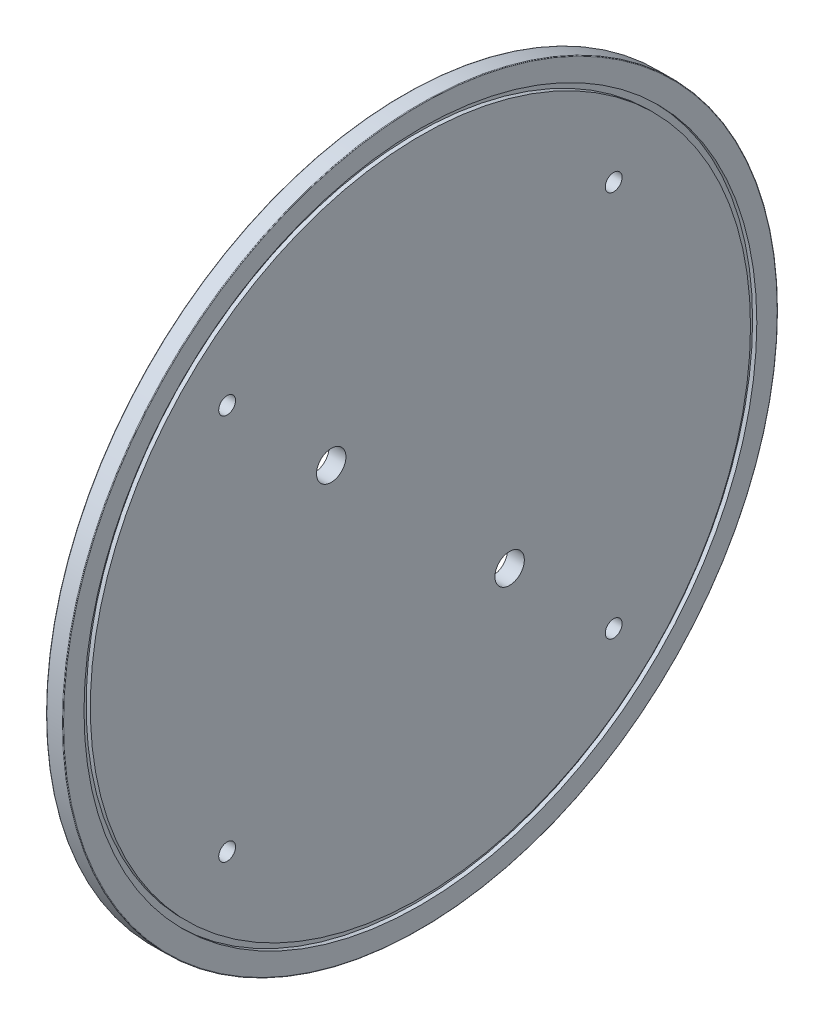
ISO-10303-21;
HEADER;
FILE_DESCRIPTION(('STEP AP214'),'2;1');
FILE_NAME('part.step','',(''),(''),'','','');
FILE_SCHEMA(('AUTOMOTIVE_DESIGN { 1 0 10303 214 1 1 1 1 }'));
ENDSEC;
DATA;
#1=APPLICATION_CONTEXT('core data for automotive mechanical design processes');
#2=APPLICATION_PROTOCOL_DEFINITION('international standard','automotive_design',2000,#1);
#3=PRODUCT_CONTEXT('',#1,'mechanical');
#4=PRODUCT('Part','Part','',(#3));
#5=PRODUCT_RELATED_PRODUCT_CATEGORY('part','',(#4));
#6=PRODUCT_DEFINITION_FORMATION('','',#4);
#7=PRODUCT_DEFINITION_CONTEXT('part definition',#1,'design');
#8=PRODUCT_DEFINITION('design','',#6,#7);
#9=PRODUCT_DEFINITION_SHAPE('','',#8);
#10=(LENGTH_UNIT() NAMED_UNIT(*) SI_UNIT(.MILLI.,.METRE.));
#11=(NAMED_UNIT(*) PLANE_ANGLE_UNIT() SI_UNIT($,.RADIAN.));
#12=(NAMED_UNIT(*) SI_UNIT($,.STERADIAN.) SOLID_ANGLE_UNIT());
#13=UNCERTAINTY_MEASURE_WITH_UNIT(LENGTH_MEASURE(1.E-05),#10,'distance_accuracy_value','');
#14=(GEOMETRIC_REPRESENTATION_CONTEXT(3) GLOBAL_UNCERTAINTY_ASSIGNED_CONTEXT((#13)) GLOBAL_UNIT_ASSIGNED_CONTEXT((#10,
#11,#12)) REPRESENTATION_CONTEXT('',''));
#15=CARTESIAN_POINT('',(0.,0.,0.));
#16=DIRECTION('',(0.,0.,1.));
#17=DIRECTION('',(1.,0.,0.));
#18=AXIS2_PLACEMENT_3D('',#15,#16,#17);
#19=CARTESIAN_POINT('',(8.,0.,0.));
#20=DIRECTION('',(1.,0.,0.));
#21=DIRECTION('',(0.,0.,-1.));
#22=AXIS2_PLACEMENT_3D('',#19,#20,#21);
#23=PLANE('',#22);
#24=CARTESIAN_POINT('',(8.,42.4264068711929,42.4264068711929));
#25=DIRECTION('',(1.,0.,0.));
#26=DIRECTION('',(0.,0.,1.));
#27=AXIS2_PLACEMENT_3D('',#24,#25,#26);
#28=CIRCLE('',#27,7.);
#29=CARTESIAN_POINT('',(8.,42.4264068711929,49.4264068711929));
#30=VERTEX_POINT('',#29);
#31=EDGE_CURVE('E117',#30,#30,#28,.T.);
#32=ORIENTED_EDGE('',*,*,#31,.F.);
#33=EDGE_LOOP('',(#32));
#34=FACE_BOUND('',#33,.T.);
#35=CARTESIAN_POINT('',(8.,-42.4264068711929,-42.4264068711929));
#36=DIRECTION('',(1.,0.,0.));
#37=DIRECTION('',(0.,0.,-1.));
#38=AXIS2_PLACEMENT_3D('',#35,#36,#37);
#39=CIRCLE('',#38,7.);
#40=CARTESIAN_POINT('',(8.,-42.4264068711929,-49.4264068711929));
#41=VERTEX_POINT('',#40);
#42=EDGE_CURVE('E109',#41,#41,#39,.T.);
#43=ORIENTED_EDGE('',*,*,#42,.F.);
#44=EDGE_LOOP('',(#43));
#45=FACE_BOUND('',#44,.T.);
#46=CARTESIAN_POINT('',(8.,91.9238815542512,91.9238815542512));
#47=DIRECTION('',(1.,0.,0.));
#48=DIRECTION('',(0.,0.,-1.));
#49=AXIS2_PLACEMENT_3D('',#46,#47,#48);
#50=CIRCLE('',#49,4.00000000000001);
#51=CARTESIAN_POINT('',(8.,91.9238815542512,87.9238815542512));
#52=VERTEX_POINT('',#51);
#53=EDGE_CURVE('E66',#52,#52,#50,.T.);
#54=ORIENTED_EDGE('',*,*,#53,.F.);
#55=EDGE_LOOP('',(#54));
#56=FACE_BOUND('',#55,.T.);
#57=CARTESIAN_POINT('',(8.,91.9238815542521,-91.9238815542502));
#58=DIRECTION('',(1.,0.,0.));
#59=DIRECTION('',(0.,-1.,0.));
#60=AXIS2_PLACEMENT_3D('',#57,#58,#59);
#61=CIRCLE('',#60,4.00000000000001);
#62=CARTESIAN_POINT('',(8.,87.9238815542521,-91.9238815542502));
#63=VERTEX_POINT('',#62);
#64=EDGE_CURVE('E82',#63,#63,#61,.T.);
#65=ORIENTED_EDGE('',*,*,#64,.F.);
#66=EDGE_LOOP('',(#65));
#67=FACE_BOUND('',#66,.T.);
#68=CARTESIAN_POINT('',(8.,-91.9238815542512,-91.9238815542512));
#69=DIRECTION('',(1.,0.,0.));
#70=DIRECTION('',(0.,0.,1.));
#71=AXIS2_PLACEMENT_3D('',#68,#69,#70);
#72=CIRCLE('',#71,4.00000000000001);
#73=CARTESIAN_POINT('',(8.,-91.9238815542512,-87.9238815542512));
#74=VERTEX_POINT('',#73);
#75=EDGE_CURVE('E86',#74,#74,#72,.T.);
#76=ORIENTED_EDGE('',*,*,#75,.F.);
#77=EDGE_LOOP('',(#76));
#78=FACE_BOUND('',#77,.T.);
#79=CARTESIAN_POINT('',(8.,-91.9238815542515,91.9238815542508));
#80=DIRECTION('',(1.,0.,0.));
#81=DIRECTION('',(0.,1.,0.));
#82=AXIS2_PLACEMENT_3D('',#79,#80,#81);
#83=CIRCLE('',#82,4.00000000000001);
#84=CARTESIAN_POINT('',(8.,-87.9238815542515,91.9238815542509));
#85=VERTEX_POINT('',#84);
#86=EDGE_CURVE('E75',#85,#85,#83,.T.);
#87=ORIENTED_EDGE('',*,*,#86,.F.);
#88=EDGE_LOOP('',(#87));
#89=FACE_BOUND('',#88,.T.);
#90=CARTESIAN_POINT('',(8.,0.,0.));
#91=DIRECTION('',(1.,0.,0.));
#92=DIRECTION('',(0.,0.,-1.));
#93=AXIS2_PLACEMENT_3D('',#90,#91,#92);
#94=CIRCLE('',#93,157.);
#95=CARTESIAN_POINT('',(8.,0.,-157.));
#96=VERTEX_POINT('',#95);
#97=EDGE_CURVE('E102',#96,#96,#94,.T.);
#98=ORIENTED_EDGE('',*,*,#97,.T.);
#99=EDGE_LOOP('',(#98));
#100=FACE_BOUND('',#99,.T.);
#101=ADVANCED_FACE('F37',(#34,#45,#56,#67,#78,#89,#100),#23,.T.);
#102=CARTESIAN_POINT('',(8.,0.,0.));
#103=DIRECTION('',(-1.,0.,0.));
#104=DIRECTION('',(0.,0.,1.));
#105=AXIS2_PLACEMENT_3D('',#102,#103,#104);
#106=CYLINDRICAL_SURFACE('',#105,170.);
#107=CARTESIAN_POINT('',(0.3,0.,0.));
#108=DIRECTION('',(1.,0.,0.));
#109=DIRECTION('',(0.,0.,-1.));
#110=AXIS2_PLACEMENT_3D('',#107,#108,#109);
#111=CIRCLE('',#110,170.);
#112=CARTESIAN_POINT('',(0.3,0.,-170.));
#113=VERTEX_POINT('',#112);
#114=EDGE_CURVE('E51',#113,#113,#111,.T.);
#115=ORIENTED_EDGE('',*,*,#114,.T.);
#116=EDGE_LOOP('',(#115));
#117=FACE_BOUND('',#116,.T.);
#118=CARTESIAN_POINT('',(7.7,0.,0.));
#119=DIRECTION('',(1.,0.,0.));
#120=DIRECTION('',(0.,0.,-1.));
#121=AXIS2_PLACEMENT_3D('',#118,#119,#120);
#122=CIRCLE('',#121,170.);
#123=CARTESIAN_POINT('',(7.7,0.,-170.));
#124=VERTEX_POINT('',#123);
#125=EDGE_CURVE('E57',#124,#124,#122,.F.);
#126=ORIENTED_EDGE('',*,*,#125,.T.);
#127=EDGE_LOOP('',(#126));
#128=FACE_BOUND('',#127,.T.);
#129=ADVANCED_FACE('F127',(#117,#128),#106,.T.);
#130=CARTESIAN_POINT('',(8.,0.,0.));
#131=DIRECTION('',(1.,0.,0.));
#132=DIRECTION('',(0.,0.,-1.));
#133=AXIS2_PLACEMENT_3D('',#130,#131,#132);
#134=CIRCLE('',#133,169.7);
#135=CARTESIAN_POINT('',(8.,0.,-169.7));
#136=VERTEX_POINT('',#135);
#137=EDGE_CURVE('E10',#136,#136,#134,.T.);
#138=ORIENTED_EDGE('',*,*,#137,.T.);
#139=EDGE_LOOP('',(#138));
#140=FACE_BOUND('',#139,.T.);
#141=CARTESIAN_POINT('',(8.,0.,0.));
#142=DIRECTION('',(1.,0.,0.));
#143=DIRECTION('',(0.,0.,-1.));
#144=AXIS2_PLACEMENT_3D('',#141,#142,#143);
#145=CIRCLE('',#144,160.);
#146=CARTESIAN_POINT('',(8.,0.,-160.));
#147=VERTEX_POINT('',#146);
#148=EDGE_CURVE('E94',#147,#147,#145,.T.);
#149=ORIENTED_EDGE('',*,*,#148,.F.);
#150=EDGE_LOOP('',(#149));
#151=FACE_BOUND('',#150,.T.);
#152=ADVANCED_FACE('F129',(#140,#151),#23,.T.);
#153=CARTESIAN_POINT('',(0.,0.,0.));
#154=DIRECTION('',(1.,0.,0.));
#155=DIRECTION('',(0.,0.,-1.));
#156=AXIS2_PLACEMENT_3D('',#153,#154,#155);
#157=PLANE('',#156);
#158=CARTESIAN_POINT('',(0.,42.4264068711929,42.4264068711929));
#159=DIRECTION('',(1.,0.,0.));
#160=DIRECTION('',(0.,0.,1.));
#161=AXIS2_PLACEMENT_3D('',#158,#159,#160);
#162=CIRCLE('',#161,7.);
#163=CARTESIAN_POINT('',(0.,42.4264068711929,49.4264068711929));
#164=VERTEX_POINT('',#163);
#165=EDGE_CURVE('E113',#164,#164,#162,.T.);
#166=ORIENTED_EDGE('',*,*,#165,.T.);
#167=EDGE_LOOP('',(#166));
#168=FACE_BOUND('',#167,.T.);
#169=CARTESIAN_POINT('',(0.,-42.4264068711929,-42.4264068711929));
#170=DIRECTION('',(1.,0.,0.));
#171=DIRECTION('',(0.,0.,-1.));
#172=AXIS2_PLACEMENT_3D('',#169,#170,#171);
#173=CIRCLE('',#172,7.);
#174=CARTESIAN_POINT('',(0.,-42.4264068711929,-49.4264068711929));
#175=VERTEX_POINT('',#174);
#176=EDGE_CURVE('E41',#175,#175,#173,.T.);
#177=ORIENTED_EDGE('',*,*,#176,.T.);
#178=EDGE_LOOP('',(#177));
#179=FACE_BOUND('',#178,.T.);
#180=CARTESIAN_POINT('',(0.,0.,0.));
#181=DIRECTION('',(1.,0.,0.));
#182=DIRECTION('',(0.,0.,-1.));
#183=AXIS2_PLACEMENT_3D('',#180,#181,#182);
#184=CIRCLE('',#183,169.7);
#185=CARTESIAN_POINT('',(0.,0.,-169.7));
#186=VERTEX_POINT('',#185);
#187=EDGE_CURVE('E46',#186,#186,#184,.F.);
#188=ORIENTED_EDGE('',*,*,#187,.T.);
#189=EDGE_LOOP('',(#188));
#190=FACE_BOUND('',#189,.T.);
#191=CARTESIAN_POINT('',(0.,-91.9238815542515,91.9238815542508));
#192=DIRECTION('',(1.,0.,0.));
#193=DIRECTION('',(0.,0.,-1.));
#194=AXIS2_PLACEMENT_3D('',#191,#192,#193);
#195=CIRCLE('',#194,4.00000000000001);
#196=CARTESIAN_POINT('',(0.,-91.9238815542515,87.9238815542508));
#197=VERTEX_POINT('',#196);
#198=EDGE_CURVE('E62',#197,#197,#195,.T.);
#199=ORIENTED_EDGE('',*,*,#198,.T.);
#200=EDGE_LOOP('',(#199));
#201=FACE_BOUND('',#200,.T.);
#202=CARTESIAN_POINT('',(0.,-91.9238815542512,-91.9238815542512));
#203=DIRECTION('',(1.,0.,0.));
#204=DIRECTION('',(0.,0.,-1.));
#205=AXIS2_PLACEMENT_3D('',#202,#203,#204);
#206=CIRCLE('',#205,4.00000000000001);
#207=CARTESIAN_POINT('',(0.,-91.9238815542512,-95.9238815542512));
#208=VERTEX_POINT('',#207);
#209=EDGE_CURVE('E67',#208,#208,#206,.T.);
#210=ORIENTED_EDGE('',*,*,#209,.T.);
#211=EDGE_LOOP('',(#210));
#212=FACE_BOUND('',#211,.T.);
#213=CARTESIAN_POINT('',(0.,91.9238815542521,-91.9238815542502));
#214=DIRECTION('',(1.,0.,0.));
#215=DIRECTION('',(0.,0.,-1.));
#216=AXIS2_PLACEMENT_3D('',#213,#214,#215);
#217=CIRCLE('',#216,4.00000000000001);
#218=CARTESIAN_POINT('',(0.,91.9238815542521,-95.9238815542502));
#219=VERTEX_POINT('',#218);
#220=EDGE_CURVE('E71',#219,#219,#217,.T.);
#221=ORIENTED_EDGE('',*,*,#220,.T.);
#222=EDGE_LOOP('',(#221));
#223=FACE_BOUND('',#222,.T.);
#224=CARTESIAN_POINT('',(0.,91.9238815542512,91.9238815542512));
#225=DIRECTION('',(1.,0.,0.));
#226=DIRECTION('',(0.,0.,-1.));
#227=AXIS2_PLACEMENT_3D('',#224,#225,#226);
#228=CIRCLE('',#227,4.00000000000001);
#229=CARTESIAN_POINT('',(0.,91.9238815542512,87.9238815542512));
#230=VERTEX_POINT('',#229);
#231=EDGE_CURVE('E61',#230,#230,#228,.T.);
#232=ORIENTED_EDGE('',*,*,#231,.T.);
#233=EDGE_LOOP('',(#232));
#234=FACE_BOUND('',#233,.T.);
#235=ADVANCED_FACE('F177',(#168,#179,#190,#201,#212,#223,#234),#157,.F.);
#236=CARTESIAN_POINT('',(-2.,91.9238815542512,91.9238815542512));
#237=DIRECTION('',(1.,0.,0.));
#238=DIRECTION('',(0.,0.,-1.));
#239=AXIS2_PLACEMENT_3D('',#236,#237,#238);
#240=CYLINDRICAL_SURFACE('',#239,4.00000000000001);
#241=ORIENTED_EDGE('',*,*,#53,.T.);
#242=EDGE_LOOP('',(#241));
#243=FACE_BOUND('',#242,.T.);
#244=ORIENTED_EDGE('',*,*,#231,.F.);
#245=EDGE_LOOP('',(#244));
#246=FACE_BOUND('',#245,.T.);
#247=ADVANCED_FACE('F174',(#243,#246),#240,.F.);
#248=CARTESIAN_POINT('',(-2.,91.9238815542521,-91.9238815542502));
#249=DIRECTION('',(1.,0.,0.));
#250=DIRECTION('',(0.,0.,-1.));
#251=AXIS2_PLACEMENT_3D('',#248,#249,#250);
#252=CYLINDRICAL_SURFACE('',#251,4.00000000000001);
#253=ORIENTED_EDGE('',*,*,#64,.T.);
#254=EDGE_LOOP('',(#253));
#255=FACE_BOUND('',#254,.T.);
#256=ORIENTED_EDGE('',*,*,#220,.F.);
#257=EDGE_LOOP('',(#256));
#258=FACE_BOUND('',#257,.T.);
#259=ADVANCED_FACE('F170',(#255,#258),#252,.F.);
#260=CARTESIAN_POINT('',(-2.,-91.9238815542512,-91.9238815542512));
#261=DIRECTION('',(1.,0.,0.));
#262=DIRECTION('',(0.,0.,-1.));
#263=AXIS2_PLACEMENT_3D('',#260,#261,#262);
#264=CYLINDRICAL_SURFACE('',#263,4.00000000000001);
#265=ORIENTED_EDGE('',*,*,#75,.T.);
#266=EDGE_LOOP('',(#265));
#267=FACE_BOUND('',#266,.T.);
#268=ORIENTED_EDGE('',*,*,#209,.F.);
#269=EDGE_LOOP('',(#268));
#270=FACE_BOUND('',#269,.T.);
#271=ADVANCED_FACE('F166',(#267,#270),#264,.F.);
#272=CARTESIAN_POINT('',(-2.,-91.9238815542515,91.9238815542508));
#273=DIRECTION('',(1.,0.,0.));
#274=DIRECTION('',(0.,0.,-1.));
#275=AXIS2_PLACEMENT_3D('',#272,#273,#274);
#276=CYLINDRICAL_SURFACE('',#275,4.00000000000001);
#277=ORIENTED_EDGE('',*,*,#86,.T.);
#278=EDGE_LOOP('',(#277));
#279=FACE_BOUND('',#278,.T.);
#280=ORIENTED_EDGE('',*,*,#198,.F.);
#281=EDGE_LOOP('',(#280));
#282=FACE_BOUND('',#281,.T.);
#283=ADVANCED_FACE('F162',(#279,#282),#276,.F.);
#284=CARTESIAN_POINT('',(6.,0.,0.));
#285=DIRECTION('',(1.,0.,0.));
#286=DIRECTION('',(0.,0.,-1.));
#287=AXIS2_PLACEMENT_3D('',#284,#285,#286);
#288=CYLINDRICAL_SURFACE('',#287,160.);
#289=CARTESIAN_POINT('',(6.,0.,0.));
#290=DIRECTION('',(1.,0.,0.));
#291=DIRECTION('',(0.,0.,-1.));
#292=AXIS2_PLACEMENT_3D('',#289,#290,#291);
#293=CIRCLE('',#292,160.);
#294=CARTESIAN_POINT('',(6.,0.,-160.));
#295=VERTEX_POINT('',#294);
#296=EDGE_CURVE('E87',#295,#295,#293,.T.);
#297=ORIENTED_EDGE('',*,*,#296,.F.);
#298=EDGE_LOOP('',(#297));
#299=FACE_BOUND('',#298,.T.);
#300=ORIENTED_EDGE('',*,*,#148,.T.);
#301=EDGE_LOOP('',(#300));
#302=FACE_BOUND('',#301,.T.);
#303=ADVANCED_FACE('F153',(#299,#302),#288,.F.);
#304=CARTESIAN_POINT('',(6.,0.,0.));
#305=DIRECTION('',(1.,0.,0.));
#306=DIRECTION('',(0.,0.,-1.));
#307=AXIS2_PLACEMENT_3D('',#304,#305,#306);
#308=PLANE('',#307);
#309=CARTESIAN_POINT('',(6.,0.,0.));
#310=DIRECTION('',(1.,0.,0.));
#311=DIRECTION('',(0.,0.,-1.));
#312=AXIS2_PLACEMENT_3D('',#309,#310,#311);
#313=CIRCLE('',#312,157.);
#314=CARTESIAN_POINT('',(6.,0.,-157.));
#315=VERTEX_POINT('',#314);
#316=EDGE_CURVE('E98',#315,#315,#313,.T.);
#317=ORIENTED_EDGE('',*,*,#316,.F.);
#318=EDGE_LOOP('',(#317));
#319=FACE_BOUND('',#318,.T.);
#320=ORIENTED_EDGE('',*,*,#296,.T.);
#321=EDGE_LOOP('',(#320));
#322=FACE_BOUND('',#321,.T.);
#323=ADVANCED_FACE('F145',(#319,#322),#308,.T.);
#324=CARTESIAN_POINT('',(6.,0.,0.));
#325=DIRECTION('',(1.,0.,0.));
#326=DIRECTION('',(0.,0.,-1.));
#327=AXIS2_PLACEMENT_3D('',#324,#325,#326);
#328=CYLINDRICAL_SURFACE('',#327,157.);
#329=ORIENTED_EDGE('',*,*,#316,.T.);
#330=EDGE_LOOP('',(#329));
#331=FACE_BOUND('',#330,.T.);
#332=ORIENTED_EDGE('',*,*,#97,.F.);
#333=EDGE_LOOP('',(#332));
#334=FACE_BOUND('',#333,.T.);
#335=ADVANCED_FACE('F142',(#331,#334),#328,.T.);
#336=CARTESIAN_POINT('',(0.3,0.,0.));
#337=DIRECTION('',(1.,0.,0.));
#338=DIRECTION('',(0.,0.,-1.));
#339=AXIS2_PLACEMENT_3D('',#336,#337,#338);
#340=TOROIDAL_SURFACE('',#339,169.7,0.3);
#341=ORIENTED_EDGE('',*,*,#187,.F.);
#342=EDGE_LOOP('',(#341));
#343=FACE_BOUND('',#342,.T.);
#344=ORIENTED_EDGE('',*,*,#114,.F.);
#345=EDGE_LOOP('',(#344));
#346=FACE_BOUND('',#345,.T.);
#347=ADVANCED_FACE('F144',(#343,#346),#340,.T.);
#348=CARTESIAN_POINT('',(7.7,0.,0.));
#349=DIRECTION('',(1.,0.,0.));
#350=DIRECTION('',(0.,0.,-1.));
#351=AXIS2_PLACEMENT_3D('',#348,#349,#350);
#352=TOROIDAL_SURFACE('',#351,169.7,0.3);
#353=ORIENTED_EDGE('',*,*,#125,.F.);
#354=EDGE_LOOP('',(#353));
#355=FACE_BOUND('',#354,.T.);
#356=ORIENTED_EDGE('',*,*,#137,.F.);
#357=EDGE_LOOP('',(#356));
#358=FACE_BOUND('',#357,.T.);
#359=ADVANCED_FACE('F39',(#355,#358),#352,.T.);
#360=CARTESIAN_POINT('',(-2.,-42.4264068711929,-42.4264068711929));
#361=DIRECTION('',(1.,0.,0.));
#362=DIRECTION('',(0.,0.,-1.));
#363=AXIS2_PLACEMENT_3D('',#360,#361,#362);
#364=CYLINDRICAL_SURFACE('',#363,7.);
#365=ORIENTED_EDGE('',*,*,#42,.T.);
#366=EDGE_LOOP('',(#365));
#367=FACE_BOUND('',#366,.T.);
#368=ORIENTED_EDGE('',*,*,#176,.F.);
#369=EDGE_LOOP('',(#368));
#370=FACE_BOUND('',#369,.T.);
#371=ADVANCED_FACE('F157',(#367,#370),#364,.F.);
#372=CARTESIAN_POINT('',(-2.,42.4264068711929,42.4264068711929));
#373=DIRECTION('',(1.,0.,0.));
#374=DIRECTION('',(0.,0.,1.));
#375=AXIS2_PLACEMENT_3D('',#372,#373,#374);
#376=CYLINDRICAL_SURFACE('',#375,7.);
#377=ORIENTED_EDGE('',*,*,#31,.T.);
#378=EDGE_LOOP('',(#377));
#379=FACE_BOUND('',#378,.T.);
#380=ORIENTED_EDGE('',*,*,#165,.F.);
#381=EDGE_LOOP('',(#380));
#382=FACE_BOUND('',#381,.T.);
#383=ADVANCED_FACE('F122',(#379,#382),#376,.F.);
#384=CLOSED_SHELL('',(#101,#129,#152,#235,#247,#259,#271,#283,#303,#323,#335,#347,#359,#371,#383));
#385=MANIFOLD_SOLID_BREP('B2',#384);
#386=ADVANCED_BREP_SHAPE_REPRESENTATION('',(#18,#385),#14);
#387=SHAPE_DEFINITION_REPRESENTATION(#9,#386);
ENDSEC;
END-ISO-10303-21;
